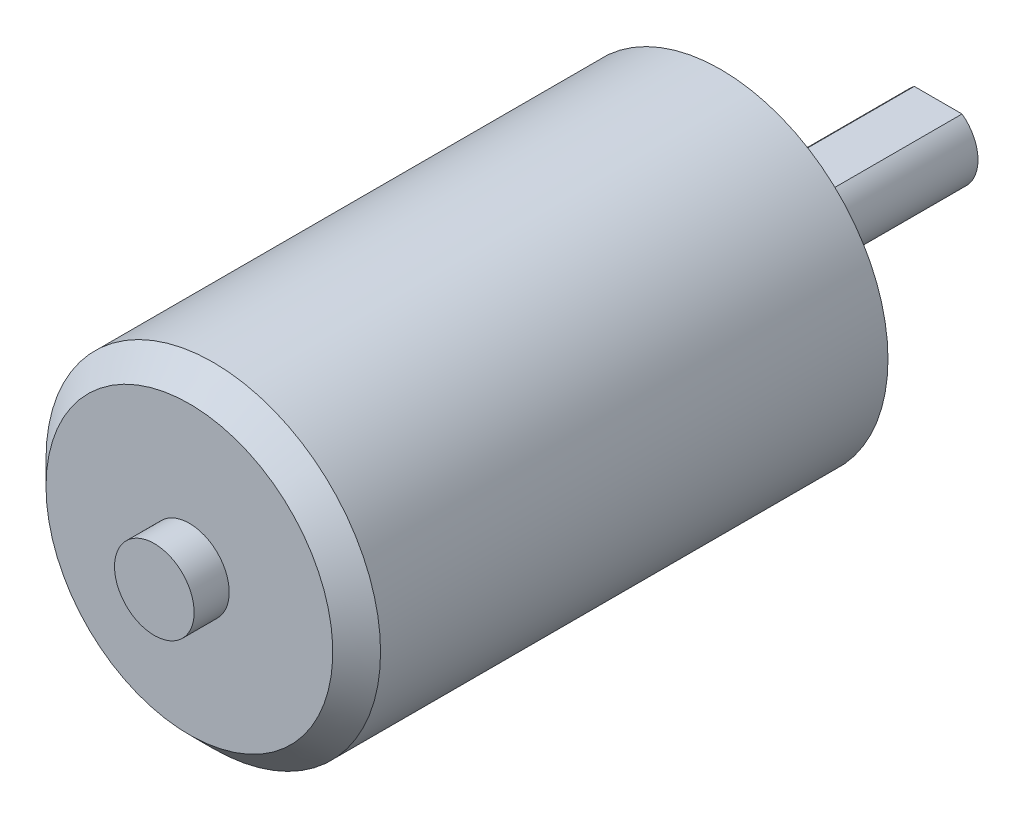
ISO-10303-21;
HEADER;
FILE_DESCRIPTION(('STEP AP214'),'2;1');
FILE_NAME('part.step','',(''),(''),'','','');
FILE_SCHEMA(('AUTOMOTIVE_DESIGN { 1 0 10303 214 1 1 1 1 }'));
ENDSEC;
DATA;
#1=APPLICATION_CONTEXT('core data for automotive mechanical design processes');
#2=APPLICATION_PROTOCOL_DEFINITION('international standard','automotive_design',2000,#1);
#3=PRODUCT_CONTEXT('',#1,'mechanical');
#4=PRODUCT('Part','Part','',(#3));
#5=PRODUCT_RELATED_PRODUCT_CATEGORY('part','',(#4));
#6=PRODUCT_DEFINITION_FORMATION('','',#4);
#7=PRODUCT_DEFINITION_CONTEXT('part definition',#1,'design');
#8=PRODUCT_DEFINITION('design','',#6,#7);
#9=PRODUCT_DEFINITION_SHAPE('','',#8);
#10=(LENGTH_UNIT() NAMED_UNIT(*) SI_UNIT(.MILLI.,.METRE.));
#11=(NAMED_UNIT(*) PLANE_ANGLE_UNIT() SI_UNIT($,.RADIAN.));
#12=(NAMED_UNIT(*) SI_UNIT($,.STERADIAN.) SOLID_ANGLE_UNIT());
#13=UNCERTAINTY_MEASURE_WITH_UNIT(LENGTH_MEASURE(1.E-05),#10,'distance_accuracy_value','');
#14=(GEOMETRIC_REPRESENTATION_CONTEXT(3) GLOBAL_UNCERTAINTY_ASSIGNED_CONTEXT((#13)) GLOBAL_UNIT_ASSIGNED_CONTEXT((#10,
#11,#12)) REPRESENTATION_CONTEXT('',''));
#15=CARTESIAN_POINT('',(0.,0.,0.));
#16=DIRECTION('',(0.,0.,1.));
#17=DIRECTION('',(1.,0.,0.));
#18=AXIS2_PLACEMENT_3D('',#15,#16,#17);
#19=CARTESIAN_POINT('',(3.036,4.,-7.3));
#20=DIRECTION('',(0.,0.,-1.));
#21=DIRECTION('',(-1.,0.,0.));
#22=AXIS2_PLACEMENT_3D('',#19,#20,#21);
#23=PLANE('',#22);
#24=CARTESIAN_POINT('',(0.,0.,-7.2999999998));
#25=DIRECTION('',(0.,0.,1.));
#26=DIRECTION('',(1.,0.,0.));
#27=AXIS2_PLACEMENT_3D('',#24,#25,#26);
#28=CIRCLE('',#27,5.);
#29=CARTESIAN_POINT('',(-3.00000000082364,3.99999999938227,-7.2999999998));
#30=VERTEX_POINT('',#29);
#31=CARTESIAN_POINT('',(3.00000000000322,3.99999999999879,-7.2999999999));
#32=VERTEX_POINT('',#31);
#33=EDGE_CURVE('E31',#30,#32,#28,.F.);
#34=ORIENTED_EDGE('',*,*,#33,.T.);
#35=DIRECTION('',(1.,0.,0.));
#36=VECTOR('',#35,1.);
#37=CARTESIAN_POINT('',(0.,4.,-7.3));
#38=LINE('',#37,#36);
#39=EDGE_CURVE('E54',#30,#32,#38,.T.);
#40=ORIENTED_EDGE('',*,*,#39,.F.);
#41=EDGE_LOOP('',(#34,#40));
#42=FACE_BOUND('',#41,.T.);
#43=ADVANCED_FACE('F27',(#42),#23,.T.);
#44=CARTESIAN_POINT('',(-3.,4.,-27.3));
#45=DIRECTION('',(0.,1.,0.));
#46=DIRECTION('',(0.,0.,1.));
#47=AXIS2_PLACEMENT_3D('',#44,#45,#46);
#48=PLANE('',#47);
#49=DIRECTION('',(1.,0.,0.));
#50=VECTOR('',#49,1.);
#51=CARTESIAN_POINT('',(0.,4.,-27.3));
#52=LINE('',#51,#50);
#53=CARTESIAN_POINT('',(-3.00000000082364,3.99999999938227,-27.3));
#54=VERTEX_POINT('',#53);
#55=CARTESIAN_POINT('',(3.00000000000322,3.99999999999758,-27.3));
#56=VERTEX_POINT('',#55);
#57=EDGE_CURVE('E59',#54,#56,#52,.T.);
#58=ORIENTED_EDGE('',*,*,#57,.F.);
#59=DIRECTION('',(0.,0.,-1.));
#60=VECTOR('',#59,1.);
#61=CARTESIAN_POINT('',(-3.00000000164728,3.99999999876454,-14.65));
#62=LINE('',#61,#60);
#63=EDGE_CURVE('E61',#54,#30,#62,.F.);
#64=ORIENTED_EDGE('',*,*,#63,.T.);
#65=ORIENTED_EDGE('',*,*,#39,.T.);
#66=DIRECTION('',(0.,0.,1.));
#67=VECTOR('',#66,1.);
#68=CARTESIAN_POINT('',(3.00000000000645,3.99999999999516,-14.65));
#69=LINE('',#68,#67);
#70=EDGE_CURVE('E63',#32,#56,#69,.F.);
#71=ORIENTED_EDGE('',*,*,#70,.T.);
#72=EDGE_LOOP('',(#58,#64,#65,#71));
#73=FACE_BOUND('',#72,.T.);
#74=ADVANCED_FACE('F60',(#73),#48,.T.);
#75=CARTESIAN_POINT('',(5.06,-5.054,-27.3));
#76=DIRECTION('',(0.,0.,-1.));
#77=DIRECTION('',(-1.,0.,0.));
#78=AXIS2_PLACEMENT_3D('',#75,#76,#77);
#79=PLANE('',#78);
#80=ORIENTED_EDGE('',*,*,#57,.T.);
#81=CARTESIAN_POINT('',(0.,0.,-27.3));
#82=DIRECTION('',(0.,0.,1.));
#83=DIRECTION('',(1.,0.,0.));
#84=AXIS2_PLACEMENT_3D('',#81,#82,#83);
#85=CIRCLE('',#84,5.);
#86=EDGE_CURVE('E45',#56,#54,#85,.F.);
#87=ORIENTED_EDGE('',*,*,#86,.T.);
#88=EDGE_LOOP('',(#80,#87));
#89=FACE_BOUND('',#88,.T.);
#90=ADVANCED_FACE('F66',(#89),#79,.T.);
#91=CARTESIAN_POINT('',(0.,0.,-27.3));
#92=DIRECTION('',(0.,0.,1.));
#93=DIRECTION('',(1.,0.,0.));
#94=AXIS2_PLACEMENT_3D('',#91,#92,#93);
#95=CYLINDRICAL_SURFACE('',#94,5.);
#96=CARTESIAN_POINT('',(0.,0.,-2.));
#97=DIRECTION('',(0.,0.,1.));
#98=DIRECTION('',(1.,0.,0.));
#99=AXIS2_PLACEMENT_3D('',#96,#97,#98);
#100=CIRCLE('',#99,5.);
#101=CARTESIAN_POINT('',(5.,0.,-2.));
#102=VERTEX_POINT('',#101);
#103=EDGE_CURVE('E67',#102,#102,#100,.T.);
#104=ORIENTED_EDGE('',*,*,#103,.F.);
#105=EDGE_LOOP('',(#104));
#106=FACE_BOUND('',#105,.T.);
#107=ORIENTED_EDGE('',*,*,#86,.F.);
#108=ORIENTED_EDGE('',*,*,#70,.F.);
#109=ORIENTED_EDGE('',*,*,#33,.F.);
#110=ORIENTED_EDGE('',*,*,#63,.F.);
#111=EDGE_LOOP('',(#107,#108,#109,#110));
#112=FACE_BOUND('',#111,.T.);
#113=ADVANCED_FACE('F68',(#106,#112),#95,.T.);
#114=CARTESIAN_POINT('',(12.65,-12.65,-2.));
#115=DIRECTION('',(0.,0.,-1.));
#116=DIRECTION('',(-1.,0.,0.));
#117=AXIS2_PLACEMENT_3D('',#114,#115,#116);
#118=PLANE('',#117);
#119=ORIENTED_EDGE('',*,*,#103,.T.);
#120=EDGE_LOOP('',(#119));
#121=FACE_BOUND('',#120,.T.);
#122=CARTESIAN_POINT('',(0.,0.,-2.));
#123=DIRECTION('',(0.,0.,1.));
#124=DIRECTION('',(1.,0.,0.));
#125=AXIS2_PLACEMENT_3D('',#122,#123,#124);
#126=CIRCLE('',#125,12.5);
#127=CARTESIAN_POINT('',(12.5,0.,-2.));
#128=VERTEX_POINT('',#127);
#129=EDGE_CURVE('E135',#128,#128,#126,.F.);
#130=ORIENTED_EDGE('',*,*,#129,.T.);
#131=EDGE_LOOP('',(#130));
#132=FACE_BOUND('',#131,.T.);
#133=ADVANCED_FACE('F141',(#121,#132),#118,.T.);
#134=CARTESIAN_POINT('',(2.024,15.476,10.));
#135=DIRECTION('',(0.,0.,-1.));
#136=DIRECTION('',(-1.,0.,0.));
#137=AXIS2_PLACEMENT_3D('',#134,#135,#136);
#138=PLANE('',#137);
#139=CARTESIAN_POINT('',(0.,17.5,10.));
#140=DIRECTION('',(0.,0.,-1.));
#141=DIRECTION('',(0.,1.,0.));
#142=AXIS2_PLACEMENT_3D('',#139,#140,#141);
#143=CIRCLE('',#142,2.);
#144=CARTESIAN_POINT('',(0.,19.5,10.));
#145=VERTEX_POINT('',#144);
#146=EDGE_CURVE('E132',#145,#145,#143,.F.);
#147=ORIENTED_EDGE('',*,*,#146,.F.);
#148=EDGE_LOOP('',(#147));
#149=FACE_BOUND('',#148,.T.);
#150=ADVANCED_FACE('F151',(#149),#138,.T.);
#151=CARTESIAN_POINT('',(14.904368671,9.844368671,10.));
#152=DIRECTION('',(0.,0.,-1.));
#153=DIRECTION('',(-1.,0.,0.));
#154=AXIS2_PLACEMENT_3D('',#151,#152,#153);
#155=PLANE('',#154);
#156=CARTESIAN_POINT('',(12.374368671,12.374368671,10.));
#157=DIRECTION('',(0.,0.,-1.));
#158=DIRECTION('',(0.,1.,0.));
#159=AXIS2_PLACEMENT_3D('',#156,#157,#158);
#160=CIRCLE('',#159,2.5);
#161=CARTESIAN_POINT('',(12.374368671,14.874368671,10.));
#162=VERTEX_POINT('',#161);
#163=EDGE_CURVE('E129',#162,#162,#160,.F.);
#164=ORIENTED_EDGE('',*,*,#163,.F.);
#165=EDGE_LOOP('',(#164));
#166=FACE_BOUND('',#165,.T.);
#167=ADVANCED_FACE('F283',(#166),#155,.T.);
#168=CARTESIAN_POINT('',(14.904368671,-14.904368671,10.));
#169=DIRECTION('',(0.,0.,-1.));
#170=DIRECTION('',(-1.,0.,0.));
#171=AXIS2_PLACEMENT_3D('',#168,#169,#170);
#172=PLANE('',#171);
#173=CARTESIAN_POINT('',(12.374368671,-12.374368671,10.));
#174=DIRECTION('',(0.,0.,-1.));
#175=DIRECTION('',(0.,1.,0.));
#176=AXIS2_PLACEMENT_3D('',#173,#174,#175);
#177=CIRCLE('',#176,2.5);
#178=CARTESIAN_POINT('',(12.374368671,-9.874368671,10.));
#179=VERTEX_POINT('',#178);
#180=EDGE_CURVE('E126',#179,#179,#177,.F.);
#181=ORIENTED_EDGE('',*,*,#180,.F.);
#182=EDGE_LOOP('',(#181));
#183=FACE_BOUND('',#182,.T.);
#184=ADVANCED_FACE('F279',(#183),#172,.T.);
#185=CARTESIAN_POINT('',(-9.844368671,-14.904368671,10.));
#186=DIRECTION('',(0.,0.,-1.));
#187=DIRECTION('',(-1.,0.,0.));
#188=AXIS2_PLACEMENT_3D('',#185,#186,#187);
#189=PLANE('',#188);
#190=CARTESIAN_POINT('',(-12.374368671,-12.374368671,10.));
#191=DIRECTION('',(0.,0.,-1.));
#192=DIRECTION('',(0.,1.,0.));
#193=AXIS2_PLACEMENT_3D('',#190,#191,#192);
#194=CIRCLE('',#193,2.5);
#195=CARTESIAN_POINT('',(-12.374368671,-9.874368671,10.));
#196=VERTEX_POINT('',#195);
#197=EDGE_CURVE('E123',#196,#196,#194,.F.);
#198=ORIENTED_EDGE('',*,*,#197,.F.);
#199=EDGE_LOOP('',(#198));
#200=FACE_BOUND('',#199,.T.);
#201=ADVANCED_FACE('F275',(#200),#189,.T.);
#202=CARTESIAN_POINT('',(-15.476,-2.024,10.));
#203=DIRECTION('',(0.,0.,-1.));
#204=DIRECTION('',(-1.,0.,0.));
#205=AXIS2_PLACEMENT_3D('',#202,#203,#204);
#206=PLANE('',#205);
#207=CARTESIAN_POINT('',(-17.5,0.,10.));
#208=DIRECTION('',(0.,0.,-1.));
#209=DIRECTION('',(0.,1.,0.));
#210=AXIS2_PLACEMENT_3D('',#207,#208,#209);
#211=CIRCLE('',#210,2.);
#212=CARTESIAN_POINT('',(-17.5,2.,10.));
#213=VERTEX_POINT('',#212);
#214=EDGE_CURVE('E120',#213,#213,#211,.F.);
#215=ORIENTED_EDGE('',*,*,#214,.F.);
#216=EDGE_LOOP('',(#215));
#217=FACE_BOUND('',#216,.T.);
#218=ADVANCED_FACE('F271',(#217),#206,.T.);
#219=CARTESIAN_POINT('',(19.524,-2.024,10.));
#220=DIRECTION('',(0.,0.,-1.));
#221=DIRECTION('',(-1.,0.,0.));
#222=AXIS2_PLACEMENT_3D('',#219,#220,#221);
#223=PLANE('',#222);
#224=CARTESIAN_POINT('',(17.5,0.,10.));
#225=DIRECTION('',(0.,0.,-1.));
#226=DIRECTION('',(0.,1.,0.));
#227=AXIS2_PLACEMENT_3D('',#224,#225,#226);
#228=CIRCLE('',#227,2.);
#229=CARTESIAN_POINT('',(17.5,2.,10.));
#230=VERTEX_POINT('',#229);
#231=EDGE_CURVE('E117',#230,#230,#228,.F.);
#232=ORIENTED_EDGE('',*,*,#231,.F.);
#233=EDGE_LOOP('',(#232));
#234=FACE_BOUND('',#233,.T.);
#235=ADVANCED_FACE('F267',(#234),#223,.T.);
#236=CARTESIAN_POINT('',(2.024,-19.524,10.));
#237=DIRECTION('',(0.,0.,-1.));
#238=DIRECTION('',(-1.,0.,0.));
#239=AXIS2_PLACEMENT_3D('',#236,#237,#238);
#240=PLANE('',#239);
#241=CARTESIAN_POINT('',(0.,-17.5,10.));
#242=DIRECTION('',(0.,0.,-1.));
#243=DIRECTION('',(0.,1.,0.));
#244=AXIS2_PLACEMENT_3D('',#241,#242,#243);
#245=CIRCLE('',#244,2.);
#246=CARTESIAN_POINT('',(0.,-15.5,10.));
#247=VERTEX_POINT('',#246);
#248=EDGE_CURVE('E114',#247,#247,#245,.F.);
#249=ORIENTED_EDGE('',*,*,#248,.F.);
#250=EDGE_LOOP('',(#249));
#251=FACE_BOUND('',#250,.T.);
#252=ADVANCED_FACE('F219',(#251),#240,.T.);
#253=CARTESIAN_POINT('',(-9.844368671,9.844368671,10.));
#254=DIRECTION('',(0.,0.,-1.));
#255=DIRECTION('',(-1.,0.,0.));
#256=AXIS2_PLACEMENT_3D('',#253,#254,#255);
#257=PLANE('',#256);
#258=CARTESIAN_POINT('',(-12.374368671,12.374368671,10.));
#259=DIRECTION('',(0.,0.,-1.));
#260=DIRECTION('',(0.,1.,0.));
#261=AXIS2_PLACEMENT_3D('',#258,#259,#260);
#262=CIRCLE('',#261,2.5);
#263=CARTESIAN_POINT('',(-12.374368671,14.874368671,10.));
#264=VERTEX_POINT('',#263);
#265=EDGE_CURVE('E111',#264,#264,#262,.F.);
#266=ORIENTED_EDGE('',*,*,#265,.F.);
#267=EDGE_LOOP('',(#266));
#268=FACE_BOUND('',#267,.T.);
#269=ADVANCED_FACE('F214',(#268),#257,.T.);
#270=CARTESIAN_POINT('',(0.,0.,-2.));
#271=DIRECTION('',(0.,0.,1.));
#272=DIRECTION('',(1.,0.,0.));
#273=AXIS2_PLACEMENT_3D('',#270,#271,#272);
#274=CONICAL_SURFACE('',#273,12.5,0.785398163397449);
#275=ORIENTED_EDGE('',*,*,#129,.F.);
#276=EDGE_LOOP('',(#275));
#277=FACE_BOUND('',#276,.T.);
#278=CARTESIAN_POINT('',(0.,0.,-1.5));
#279=DIRECTION('',(0.,0.,1.));
#280=DIRECTION('',(1.,0.,0.));
#281=AXIS2_PLACEMENT_3D('',#278,#279,#280);
#282=CIRCLE('',#281,13.);
#283=CARTESIAN_POINT('',(13.,0.,-1.5));
#284=VERTEX_POINT('',#283);
#285=EDGE_CURVE('E110',#284,#284,#282,.F.);
#286=ORIENTED_EDGE('',*,*,#285,.T.);
#287=EDGE_LOOP('',(#286));
#288=FACE_BOUND('',#287,.T.);
#289=ADVANCED_FACE('F211',(#277,#288),#274,.T.);
#290=CARTESIAN_POINT('',(0.,17.5,10.));
#291=DIRECTION('',(0.,0.,-1.));
#292=DIRECTION('',(0.,1.,0.));
#293=AXIS2_PLACEMENT_3D('',#290,#291,#292);
#294=CYLINDRICAL_SURFACE('',#293,2.);
#295=ORIENTED_EDGE('',*,*,#146,.T.);
#296=EDGE_LOOP('',(#295));
#297=FACE_BOUND('',#296,.T.);
#298=CARTESIAN_POINT('',(0.,17.5,0.));
#299=DIRECTION('',(0.,0.,-1.));
#300=DIRECTION('',(0.,1.,0.));
#301=AXIS2_PLACEMENT_3D('',#298,#299,#300);
#302=CIRCLE('',#301,2.);
#303=CARTESIAN_POINT('',(0.,19.5,0.));
#304=VERTEX_POINT('',#303);
#305=EDGE_CURVE('E107',#304,#304,#302,.T.);
#306=ORIENTED_EDGE('',*,*,#305,.T.);
#307=EDGE_LOOP('',(#306));
#308=FACE_BOUND('',#307,.T.);
#309=ADVANCED_FACE('F208',(#297,#308),#294,.F.);
#310=CARTESIAN_POINT('',(12.374368671,12.374368671,10.));
#311=DIRECTION('',(0.,0.,-1.));
#312=DIRECTION('',(0.,1.,0.));
#313=AXIS2_PLACEMENT_3D('',#310,#311,#312);
#314=CYLINDRICAL_SURFACE('',#313,2.5);
#315=ORIENTED_EDGE('',*,*,#163,.T.);
#316=EDGE_LOOP('',(#315));
#317=FACE_BOUND('',#316,.T.);
#318=CARTESIAN_POINT('',(12.374368671,12.374368671,0.));
#319=DIRECTION('',(0.,0.,-1.));
#320=DIRECTION('',(0.,1.,0.));
#321=AXIS2_PLACEMENT_3D('',#318,#319,#320);
#322=CIRCLE('',#321,2.5);
#323=CARTESIAN_POINT('',(12.374368671,14.874368671,0.));
#324=VERTEX_POINT('',#323);
#325=EDGE_CURVE('E104',#324,#324,#322,.T.);
#326=ORIENTED_EDGE('',*,*,#325,.T.);
#327=EDGE_LOOP('',(#326));
#328=FACE_BOUND('',#327,.T.);
#329=ADVANCED_FACE('F204',(#317,#328),#314,.F.);
#330=CARTESIAN_POINT('',(12.374368671,-12.374368671,10.));
#331=DIRECTION('',(0.,0.,-1.));
#332=DIRECTION('',(0.,1.,0.));
#333=AXIS2_PLACEMENT_3D('',#330,#331,#332);
#334=CYLINDRICAL_SURFACE('',#333,2.5);
#335=ORIENTED_EDGE('',*,*,#180,.T.);
#336=EDGE_LOOP('',(#335));
#337=FACE_BOUND('',#336,.T.);
#338=CARTESIAN_POINT('',(12.374368671,-12.374368671,0.));
#339=DIRECTION('',(0.,0.,-1.));
#340=DIRECTION('',(0.,1.,0.));
#341=AXIS2_PLACEMENT_3D('',#338,#339,#340);
#342=CIRCLE('',#341,2.5);
#343=CARTESIAN_POINT('',(12.374368671,-9.874368671,0.));
#344=VERTEX_POINT('',#343);
#345=EDGE_CURVE('E101',#344,#344,#342,.T.);
#346=ORIENTED_EDGE('',*,*,#345,.T.);
#347=EDGE_LOOP('',(#346));
#348=FACE_BOUND('',#347,.T.);
#349=ADVANCED_FACE('F200',(#337,#348),#334,.F.);
#350=CARTESIAN_POINT('',(-12.374368671,-12.374368671,10.));
#351=DIRECTION('',(0.,0.,-1.));
#352=DIRECTION('',(0.,1.,0.));
#353=AXIS2_PLACEMENT_3D('',#350,#351,#352);
#354=CYLINDRICAL_SURFACE('',#353,2.5);
#355=ORIENTED_EDGE('',*,*,#197,.T.);
#356=EDGE_LOOP('',(#355));
#357=FACE_BOUND('',#356,.T.);
#358=CARTESIAN_POINT('',(-12.374368671,-12.374368671,0.));
#359=DIRECTION('',(0.,0.,-1.));
#360=DIRECTION('',(0.,1.,0.));
#361=AXIS2_PLACEMENT_3D('',#358,#359,#360);
#362=CIRCLE('',#361,2.5);
#363=CARTESIAN_POINT('',(-12.374368671,-9.874368671,0.));
#364=VERTEX_POINT('',#363);
#365=EDGE_CURVE('E98',#364,#364,#362,.T.);
#366=ORIENTED_EDGE('',*,*,#365,.T.);
#367=EDGE_LOOP('',(#366));
#368=FACE_BOUND('',#367,.T.);
#369=ADVANCED_FACE('F196',(#357,#368),#354,.F.);
#370=CARTESIAN_POINT('',(-17.5,0.,10.));
#371=DIRECTION('',(0.,0.,-1.));
#372=DIRECTION('',(0.,1.,0.));
#373=AXIS2_PLACEMENT_3D('',#370,#371,#372);
#374=CYLINDRICAL_SURFACE('',#373,2.);
#375=ORIENTED_EDGE('',*,*,#214,.T.);
#376=EDGE_LOOP('',(#375));
#377=FACE_BOUND('',#376,.T.);
#378=CARTESIAN_POINT('',(-17.5,0.,0.));
#379=DIRECTION('',(0.,0.,-1.));
#380=DIRECTION('',(0.,1.,0.));
#381=AXIS2_PLACEMENT_3D('',#378,#379,#380);
#382=CIRCLE('',#381,2.);
#383=CARTESIAN_POINT('',(-17.5,1.99999999999999,0.));
#384=VERTEX_POINT('',#383);
#385=EDGE_CURVE('E95',#384,#384,#382,.T.);
#386=ORIENTED_EDGE('',*,*,#385,.T.);
#387=EDGE_LOOP('',(#386));
#388=FACE_BOUND('',#387,.T.);
#389=ADVANCED_FACE('F192',(#377,#388),#374,.F.);
#390=CARTESIAN_POINT('',(17.5,0.,10.));
#391=DIRECTION('',(0.,0.,-1.));
#392=DIRECTION('',(0.,1.,0.));
#393=AXIS2_PLACEMENT_3D('',#390,#391,#392);
#394=CYLINDRICAL_SURFACE('',#393,2.);
#395=ORIENTED_EDGE('',*,*,#231,.T.);
#396=EDGE_LOOP('',(#395));
#397=FACE_BOUND('',#396,.T.);
#398=CARTESIAN_POINT('',(17.5,0.,0.));
#399=DIRECTION('',(0.,0.,-1.));
#400=DIRECTION('',(0.,1.,0.));
#401=AXIS2_PLACEMENT_3D('',#398,#399,#400);
#402=CIRCLE('',#401,2.);
#403=CARTESIAN_POINT('',(17.5,2.,0.));
#404=VERTEX_POINT('',#403);
#405=EDGE_CURVE('E92',#404,#404,#402,.T.);
#406=ORIENTED_EDGE('',*,*,#405,.T.);
#407=EDGE_LOOP('',(#406));
#408=FACE_BOUND('',#407,.T.);
#409=ADVANCED_FACE('F188',(#397,#408),#394,.F.);
#410=CARTESIAN_POINT('',(0.,-17.5,10.));
#411=DIRECTION('',(0.,0.,-1.));
#412=DIRECTION('',(0.,1.,0.));
#413=AXIS2_PLACEMENT_3D('',#410,#411,#412);
#414=CYLINDRICAL_SURFACE('',#413,2.);
#415=ORIENTED_EDGE('',*,*,#248,.T.);
#416=EDGE_LOOP('',(#415));
#417=FACE_BOUND('',#416,.T.);
#418=CARTESIAN_POINT('',(0.,-17.5,0.));
#419=DIRECTION('',(0.,0.,-1.));
#420=DIRECTION('',(0.,1.,0.));
#421=AXIS2_PLACEMENT_3D('',#418,#419,#420);
#422=CIRCLE('',#421,2.);
#423=CARTESIAN_POINT('',(0.,-15.5,0.));
#424=VERTEX_POINT('',#423);
#425=EDGE_CURVE('E89',#424,#424,#422,.T.);
#426=ORIENTED_EDGE('',*,*,#425,.T.);
#427=EDGE_LOOP('',(#426));
#428=FACE_BOUND('',#427,.T.);
#429=ADVANCED_FACE('F184',(#417,#428),#414,.F.);
#430=CARTESIAN_POINT('',(-12.374368671,12.374368671,10.));
#431=DIRECTION('',(0.,0.,-1.));
#432=DIRECTION('',(0.,1.,0.));
#433=AXIS2_PLACEMENT_3D('',#430,#431,#432);
#434=CYLINDRICAL_SURFACE('',#433,2.5);
#435=ORIENTED_EDGE('',*,*,#265,.T.);
#436=EDGE_LOOP('',(#435));
#437=FACE_BOUND('',#436,.T.);
#438=CARTESIAN_POINT('',(-12.374368671,12.374368671,0.));
#439=DIRECTION('',(0.,0.,-1.));
#440=DIRECTION('',(0.,1.,0.));
#441=AXIS2_PLACEMENT_3D('',#438,#439,#440);
#442=CIRCLE('',#441,2.5);
#443=CARTESIAN_POINT('',(-12.374368671,14.874368671,0.));
#444=VERTEX_POINT('',#443);
#445=EDGE_CURVE('E86',#444,#444,#442,.T.);
#446=ORIENTED_EDGE('',*,*,#445,.T.);
#447=EDGE_LOOP('',(#446));
#448=FACE_BOUND('',#447,.T.);
#449=ADVANCED_FACE('F180',(#437,#448),#434,.F.);
#450=CARTESIAN_POINT('',(0.,0.,-1.5));
#451=DIRECTION('',(0.,0.,1.));
#452=DIRECTION('',(1.,0.,0.));
#453=AXIS2_PLACEMENT_3D('',#450,#451,#452);
#454=CYLINDRICAL_SURFACE('',#453,13.);
#455=ORIENTED_EDGE('',*,*,#285,.F.);
#456=EDGE_LOOP('',(#455));
#457=FACE_BOUND('',#456,.T.);
#458=CARTESIAN_POINT('',(0.,0.,0.));
#459=DIRECTION('',(0.,0.,1.));
#460=DIRECTION('',(1.,0.,0.));
#461=AXIS2_PLACEMENT_3D('',#458,#459,#460);
#462=CIRCLE('',#461,13.);
#463=CARTESIAN_POINT('',(13.,0.,0.));
#464=VERTEX_POINT('',#463);
#465=EDGE_CURVE('E83',#464,#464,#462,.F.);
#466=ORIENTED_EDGE('',*,*,#465,.T.);
#467=EDGE_LOOP('',(#466));
#468=FACE_BOUND('',#467,.T.);
#469=ADVANCED_FACE('F176',(#457,#468),#454,.T.);
#470=CARTESIAN_POINT('',(5.06,-5.06,71.1));
#471=DIRECTION('',(0.,0.,-1.));
#472=DIRECTION('',(-1.,0.,0.));
#473=AXIS2_PLACEMENT_3D('',#470,#471,#472);
#474=PLANE('',#473);
#475=CARTESIAN_POINT('',(0.,0.,71.1));
#476=DIRECTION('',(0.,0.,-1.));
#477=DIRECTION('',(-1.,0.,0.));
#478=AXIS2_PLACEMENT_3D('',#475,#476,#477);
#479=CIRCLE('',#478,5.);
#480=CARTESIAN_POINT('',(-5.,0.,71.1));
#481=VERTEX_POINT('',#480);
#482=EDGE_CURVE('E80',#481,#481,#479,.F.);
#483=ORIENTED_EDGE('',*,*,#482,.T.);
#484=EDGE_LOOP('',(#483));
#485=FACE_BOUND('',#484,.T.);
#486=ADVANCED_FACE('F179',(#485),#474,.F.);
#487=CARTESIAN_POINT('',(-21.252,-21.252,0.));
#488=DIRECTION('',(0.,0.,1.));
#489=DIRECTION('',(1.,0.,0.));
#490=AXIS2_PLACEMENT_3D('',#487,#488,#489);
#491=PLANE('',#490);
#492=ORIENTED_EDGE('',*,*,#465,.F.);
#493=EDGE_LOOP('',(#492));
#494=FACE_BOUND('',#493,.T.);
#495=ORIENTED_EDGE('',*,*,#445,.F.);
#496=EDGE_LOOP('',(#495));
#497=FACE_BOUND('',#496,.T.);
#498=ORIENTED_EDGE('',*,*,#425,.F.);
#499=EDGE_LOOP('',(#498));
#500=FACE_BOUND('',#499,.T.);
#501=ORIENTED_EDGE('',*,*,#405,.F.);
#502=EDGE_LOOP('',(#501));
#503=FACE_BOUND('',#502,.T.);
#504=ORIENTED_EDGE('',*,*,#385,.F.);
#505=EDGE_LOOP('',(#504));
#506=FACE_BOUND('',#505,.T.);
#507=ORIENTED_EDGE('',*,*,#365,.F.);
#508=EDGE_LOOP('',(#507));
#509=FACE_BOUND('',#508,.T.);
#510=ORIENTED_EDGE('',*,*,#345,.F.);
#511=EDGE_LOOP('',(#510));
#512=FACE_BOUND('',#511,.T.);
#513=ORIENTED_EDGE('',*,*,#325,.F.);
#514=EDGE_LOOP('',(#513));
#515=FACE_BOUND('',#514,.T.);
#516=ORIENTED_EDGE('',*,*,#305,.F.);
#517=EDGE_LOOP('',(#516));
#518=FACE_BOUND('',#517,.T.);
#519=CARTESIAN_POINT('',(0.,0.,0.));
#520=DIRECTION('',(0.,0.,-1.));
#521=DIRECTION('',(-1.,0.,0.));
#522=AXIS2_PLACEMENT_3D('',#519,#520,#521);
#523=CIRCLE('',#522,21.);
#524=CARTESIAN_POINT('',(-21.,0.,0.));
#525=VERTEX_POINT('',#524);
#526=EDGE_CURVE('E77',#525,#525,#523,.T.);
#527=ORIENTED_EDGE('',*,*,#526,.T.);
#528=EDGE_LOOP('',(#527));
#529=FACE_BOUND('',#528,.T.);
#530=ADVANCED_FACE('F174',(#494,#497,#500,#503,#506,#509,#512,#515,#518,#529),#491,.F.);
#531=CARTESIAN_POINT('',(0.,0.,71.1));
#532=DIRECTION('',(0.,0.,-1.));
#533=DIRECTION('',(-1.,0.,0.));
#534=AXIS2_PLACEMENT_3D('',#531,#532,#533);
#535=CYLINDRICAL_SURFACE('',#534,5.);
#536=CARTESIAN_POINT('',(0.,0.,66.7));
#537=DIRECTION('',(0.,0.,-1.));
#538=DIRECTION('',(-1.,0.,0.));
#539=AXIS2_PLACEMENT_3D('',#536,#537,#538);
#540=CIRCLE('',#539,5.);
#541=CARTESIAN_POINT('',(-5.,0.,66.7));
#542=VERTEX_POINT('',#541);
#543=EDGE_CURVE('E74',#542,#542,#540,.T.);
#544=ORIENTED_EDGE('',*,*,#543,.F.);
#545=EDGE_LOOP('',(#544));
#546=FACE_BOUND('',#545,.T.);
#547=ORIENTED_EDGE('',*,*,#482,.F.);
#548=EDGE_LOOP('',(#547));
#549=FACE_BOUND('',#548,.T.);
#550=ADVANCED_FACE('F170',(#546,#549),#535,.T.);
#551=CARTESIAN_POINT('',(0.,0.,63.7));
#552=DIRECTION('',(0.,0.,-1.));
#553=DIRECTION('',(-1.,0.,0.));
#554=AXIS2_PLACEMENT_3D('',#551,#552,#553);
#555=CYLINDRICAL_SURFACE('',#554,21.);
#556=ORIENTED_EDGE('',*,*,#526,.F.);
#557=EDGE_LOOP('',(#556));
#558=FACE_BOUND('',#557,.T.);
#559=CARTESIAN_POINT('',(0.,0.,63.7000000000001));
#560=DIRECTION('',(0.,0.,-1.));
#561=DIRECTION('',(-1.,0.,0.));
#562=AXIS2_PLACEMENT_3D('',#559,#560,#561);
#563=CIRCLE('',#562,21.);
#564=CARTESIAN_POINT('',(-21.,0.,63.7));
#565=VERTEX_POINT('',#564);
#566=EDGE_CURVE('E37',#565,#565,#563,.T.);
#567=ORIENTED_EDGE('',*,*,#566,.T.);
#568=EDGE_LOOP('',(#567));
#569=FACE_BOUND('',#568,.T.);
#570=ADVANCED_FACE('F163',(#558,#569),#555,.T.);
#571=CARTESIAN_POINT('',(-18.216,-18.216,66.7));
#572=DIRECTION('',(0.,0.,1.));
#573=DIRECTION('',(1.,0.,0.));
#574=AXIS2_PLACEMENT_3D('',#571,#572,#573);
#575=PLANE('',#574);
#576=ORIENTED_EDGE('',*,*,#543,.T.);
#577=EDGE_LOOP('',(#576));
#578=FACE_BOUND('',#577,.T.);
#579=CARTESIAN_POINT('',(0.,0.,66.7));
#580=DIRECTION('',(0.,0.,-1.));
#581=DIRECTION('',(-1.,0.,0.));
#582=AXIS2_PLACEMENT_3D('',#579,#580,#581);
#583=CIRCLE('',#582,18.);
#584=CARTESIAN_POINT('',(-18.,0.,66.7));
#585=VERTEX_POINT('',#584);
#586=EDGE_CURVE('E13',#585,#585,#583,.F.);
#587=ORIENTED_EDGE('',*,*,#586,.T.);
#588=EDGE_LOOP('',(#587));
#589=FACE_BOUND('',#588,.T.);
#590=ADVANCED_FACE('F29',(#578,#589),#575,.T.);
#591=CARTESIAN_POINT('',(0.,0.,66.7));
#592=DIRECTION('',(0.,0.,-1.));
#593=DIRECTION('',(-1.,0.,0.));
#594=AXIS2_PLACEMENT_3D('',#591,#592,#593);
#595=CONICAL_SURFACE('',#594,18.,0.785398163397448);
#596=ORIENTED_EDGE('',*,*,#566,.F.);
#597=EDGE_LOOP('',(#596));
#598=FACE_BOUND('',#597,.T.);
#599=ORIENTED_EDGE('',*,*,#586,.F.);
#600=EDGE_LOOP('',(#599));
#601=FACE_BOUND('',#600,.T.);
#602=ADVANCED_FACE('F156',(#598,#601),#595,.T.);
#603=CLOSED_SHELL('',(#43,#74,#90,#113,#133,#150,#167,#184,#201,#218,#235,#252,#269,#289,#309,
#329,#349,#369,#389,#409,#429,#449,#469,#486,#530,#550,#570,#590,#602));
#604=MANIFOLD_SOLID_BREP('B1',#603);
#605=ADVANCED_BREP_SHAPE_REPRESENTATION('',(#18,#604),#14);
#606=SHAPE_DEFINITION_REPRESENTATION(#9,#605);
ENDSEC;
END-ISO-10303-21;
